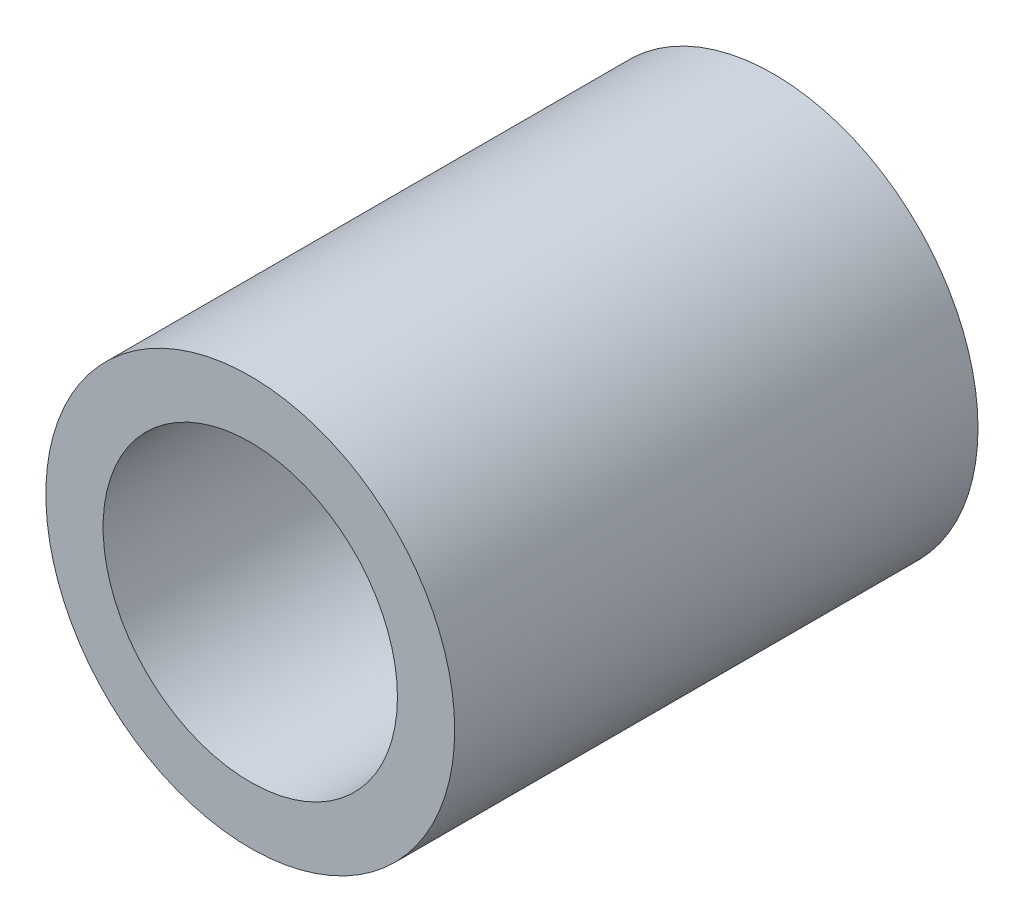
ISO-10303-21;
HEADER;
FILE_DESCRIPTION(('STEP AP214'),'2;1');
FILE_NAME('part.step','',(''),(''),'','','');
FILE_SCHEMA(('AUTOMOTIVE_DESIGN { 1 0 10303 214 1 1 1 1 }'));
ENDSEC;
DATA;
#1=APPLICATION_CONTEXT('core data for automotive mechanical design processes');
#2=APPLICATION_PROTOCOL_DEFINITION('international standard','automotive_design',2000,#1);
#3=PRODUCT_CONTEXT('',#1,'mechanical');
#4=PRODUCT('Part','Part','',(#3));
#5=PRODUCT_RELATED_PRODUCT_CATEGORY('part','',(#4));
#6=PRODUCT_DEFINITION_FORMATION('','',#4);
#7=PRODUCT_DEFINITION_CONTEXT('part definition',#1,'design');
#8=PRODUCT_DEFINITION('design','',#6,#7);
#9=PRODUCT_DEFINITION_SHAPE('','',#8);
#10=(LENGTH_UNIT() NAMED_UNIT(*) SI_UNIT(.MILLI.,.METRE.));
#11=(NAMED_UNIT(*) PLANE_ANGLE_UNIT() SI_UNIT($,.RADIAN.));
#12=(NAMED_UNIT(*) SI_UNIT($,.STERADIAN.) SOLID_ANGLE_UNIT());
#13=UNCERTAINTY_MEASURE_WITH_UNIT(LENGTH_MEASURE(1.E-05),#10,'distance_accuracy_value','');
#14=(GEOMETRIC_REPRESENTATION_CONTEXT(3) GLOBAL_UNCERTAINTY_ASSIGNED_CONTEXT((#13)) GLOBAL_UNIT_ASSIGNED_CONTEXT((#10,
#11,#12)) REPRESENTATION_CONTEXT('',''));
#15=CARTESIAN_POINT('',(0.,0.,0.));
#16=DIRECTION('',(0.,0.,1.));
#17=DIRECTION('',(1.,0.,0.));
#18=AXIS2_PLACEMENT_3D('',#15,#16,#17);
#19=CARTESIAN_POINT('',(0.,0.,16.));
#20=DIRECTION('',(0.,0.,1.));
#21=DIRECTION('',(1.,0.,0.));
#22=AXIS2_PLACEMENT_3D('',#19,#20,#21);
#23=PLANE('',#22);
#24=CARTESIAN_POINT('',(0.,0.,16.));
#25=DIRECTION('',(0.,0.,1.));
#26=DIRECTION('',(1.,0.,0.));
#27=AXIS2_PLACEMENT_3D('',#24,#25,#26);
#28=CIRCLE('',#27,12.5);
#29=CARTESIAN_POINT('',(12.5,0.,16.));
#30=VERTEX_POINT('',#29);
#31=EDGE_CURVE('E10',#30,#30,#28,.T.);
#32=ORIENTED_EDGE('',*,*,#31,.T.);
#33=EDGE_LOOP('',(#32));
#34=FACE_BOUND('',#33,.T.);
#35=CARTESIAN_POINT('',(0.,0.,16.));
#36=DIRECTION('',(0.,0.,1.));
#37=DIRECTION('',(1.,0.,0.));
#38=AXIS2_PLACEMENT_3D('',#35,#36,#37);
#39=CIRCLE('',#38,9.);
#40=CARTESIAN_POINT('',(9.,0.,16.));
#41=VERTEX_POINT('',#40);
#42=EDGE_CURVE('E41',#41,#41,#39,.T.);
#43=ORIENTED_EDGE('',*,*,#42,.F.);
#44=EDGE_LOOP('',(#43));
#45=FACE_BOUND('',#44,.T.);
#46=ADVANCED_FACE('F30',(#34,#45),#23,.T.);
#47=CARTESIAN_POINT('',(0.,0.,-16.));
#48=DIRECTION('',(0.,0.,1.));
#49=DIRECTION('',(1.,0.,0.));
#50=AXIS2_PLACEMENT_3D('',#47,#48,#49);
#51=PLANE('',#50);
#52=CARTESIAN_POINT('',(0.,0.,-16.));
#53=DIRECTION('',(0.,0.,1.));
#54=DIRECTION('',(1.,0.,0.));
#55=AXIS2_PLACEMENT_3D('',#52,#53,#54);
#56=CIRCLE('',#55,12.5);
#57=CARTESIAN_POINT('',(12.5,0.,-16.));
#58=VERTEX_POINT('',#57);
#59=EDGE_CURVE('E34',#58,#58,#56,.T.);
#60=ORIENTED_EDGE('',*,*,#59,.F.);
#61=EDGE_LOOP('',(#60));
#62=FACE_BOUND('',#61,.T.);
#63=CARTESIAN_POINT('',(0.,0.,-16.));
#64=DIRECTION('',(0.,0.,1.));
#65=DIRECTION('',(1.,0.,0.));
#66=AXIS2_PLACEMENT_3D('',#63,#64,#65);
#67=CIRCLE('',#66,9.);
#68=CARTESIAN_POINT('',(9.,0.,-16.));
#69=VERTEX_POINT('',#68);
#70=EDGE_CURVE('E43',#69,#69,#67,.T.);
#71=ORIENTED_EDGE('',*,*,#70,.T.);
#72=EDGE_LOOP('',(#71));
#73=FACE_BOUND('',#72,.T.);
#74=ADVANCED_FACE('F53',(#62,#73),#51,.F.);
#75=CARTESIAN_POINT('',(0.,0.,16.));
#76=DIRECTION('',(0.,0.,-1.));
#77=DIRECTION('',(-1.,0.,0.));
#78=AXIS2_PLACEMENT_3D('',#75,#76,#77);
#79=CYLINDRICAL_SURFACE('',#78,12.5);
#80=ORIENTED_EDGE('',*,*,#31,.F.);
#81=EDGE_LOOP('',(#80));
#82=FACE_BOUND('',#81,.T.);
#83=ORIENTED_EDGE('',*,*,#59,.T.);
#84=EDGE_LOOP('',(#83));
#85=FACE_BOUND('',#84,.T.);
#86=ADVANCED_FACE('F32',(#82,#85),#79,.T.);
#87=CARTESIAN_POINT('',(0.,0.,16.));
#88=DIRECTION('',(0.,0.,-1.));
#89=DIRECTION('',(-1.,0.,0.));
#90=AXIS2_PLACEMENT_3D('',#87,#88,#89);
#91=CYLINDRICAL_SURFACE('',#90,9.);
#92=ORIENTED_EDGE('',*,*,#42,.T.);
#93=EDGE_LOOP('',(#92));
#94=FACE_BOUND('',#93,.T.);
#95=ORIENTED_EDGE('',*,*,#70,.F.);
#96=EDGE_LOOP('',(#95));
#97=FACE_BOUND('',#96,.T.);
#98=ADVANCED_FACE('F49',(#94,#97),#91,.F.);
#99=CLOSED_SHELL('',(#46,#74,#86,#98));
#100=MANIFOLD_SOLID_BREP('B2',#99);
#101=ADVANCED_BREP_SHAPE_REPRESENTATION('',(#18,#100),#14);
#102=SHAPE_DEFINITION_REPRESENTATION(#9,#101);
ENDSEC;
END-ISO-10303-21;
